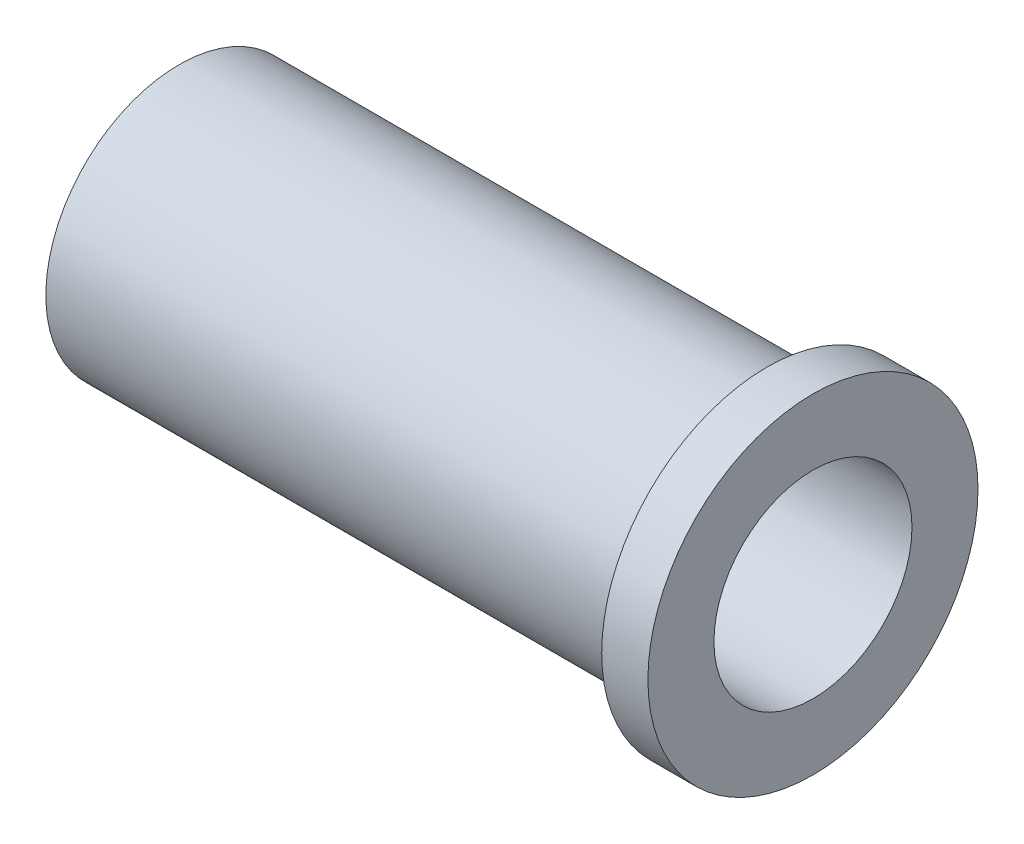
ISO-10303-21;
HEADER;
FILE_DESCRIPTION(('STEP AP214'),'2;1');
FILE_NAME('part.step','',(''),(''),'','','');
FILE_SCHEMA(('AUTOMOTIVE_DESIGN { 1 0 10303 214 1 1 1 1 }'));
ENDSEC;
DATA;
#1=APPLICATION_CONTEXT('core data for automotive mechanical design processes');
#2=APPLICATION_PROTOCOL_DEFINITION('international standard','automotive_design',2000,#1);
#3=PRODUCT_CONTEXT('',#1,'mechanical');
#4=PRODUCT('Part','Part','',(#3));
#5=PRODUCT_RELATED_PRODUCT_CATEGORY('part','',(#4));
#6=PRODUCT_DEFINITION_FORMATION('','',#4);
#7=PRODUCT_DEFINITION_CONTEXT('part definition',#1,'design');
#8=PRODUCT_DEFINITION('design','',#6,#7);
#9=PRODUCT_DEFINITION_SHAPE('','',#8);
#10=(LENGTH_UNIT() NAMED_UNIT(*) SI_UNIT(.MILLI.,.METRE.));
#11=(NAMED_UNIT(*) PLANE_ANGLE_UNIT() SI_UNIT($,.RADIAN.));
#12=(NAMED_UNIT(*) SI_UNIT($,.STERADIAN.) SOLID_ANGLE_UNIT());
#13=UNCERTAINTY_MEASURE_WITH_UNIT(LENGTH_MEASURE(1.E-05),#10,'distance_accuracy_value','');
#14=(GEOMETRIC_REPRESENTATION_CONTEXT(3) GLOBAL_UNCERTAINTY_ASSIGNED_CONTEXT((#13)) GLOBAL_UNIT_ASSIGNED_CONTEXT((#10,
#11,#12)) REPRESENTATION_CONTEXT('',''));
#15=CARTESIAN_POINT('',(0.,0.,0.));
#16=DIRECTION('',(0.,0.,1.));
#17=DIRECTION('',(1.,0.,0.));
#18=AXIS2_PLACEMENT_3D('',#15,#16,#17);
#19=CARTESIAN_POINT('',(48.,0.,0.));
#20=DIRECTION('',(-1.,0.,0.));
#21=DIRECTION('',(0.,0.,1.));
#22=AXIS2_PLACEMENT_3D('',#19,#20,#21);
#23=CYLINDRICAL_SURFACE('',#22,10.1);
#24=CARTESIAN_POINT('',(0.,0.,0.));
#25=DIRECTION('',(1.,0.,0.));
#26=DIRECTION('',(0.,0.,-1.));
#27=AXIS2_PLACEMENT_3D('',#24,#25,#26);
#28=CIRCLE('',#27,10.1);
#29=CARTESIAN_POINT('',(0.,0.,-10.1));
#30=VERTEX_POINT('',#29);
#31=EDGE_CURVE('E41',#30,#30,#28,.T.);
#32=ORIENTED_EDGE('',*,*,#31,.T.);
#33=EDGE_LOOP('',(#32));
#34=FACE_BOUND('',#33,.T.);
#35=CARTESIAN_POINT('',(44.5,0.,0.));
#36=DIRECTION('',(1.,0.,0.));
#37=DIRECTION('',(0.,0.,-1.));
#38=AXIS2_PLACEMENT_3D('',#35,#36,#37);
#39=CIRCLE('',#38,10.1);
#40=CARTESIAN_POINT('',(44.5,0.,-10.1));
#41=VERTEX_POINT('',#40);
#42=EDGE_CURVE('E10',#41,#41,#39,.T.);
#43=ORIENTED_EDGE('',*,*,#42,.F.);
#44=EDGE_LOOP('',(#43));
#45=FACE_BOUND('',#44,.T.);
#46=ADVANCED_FACE('F35',(#34,#45),#23,.T.);
#47=CARTESIAN_POINT('',(48.,0.,0.));
#48=DIRECTION('',(1.,0.,0.));
#49=DIRECTION('',(0.,0.,-1.));
#50=AXIS2_PLACEMENT_3D('',#47,#48,#49);
#51=PLANE('',#50);
#52=CARTESIAN_POINT('',(48.,0.,0.));
#53=DIRECTION('',(1.,0.,0.));
#54=DIRECTION('',(0.,0.,-1.));
#55=AXIS2_PLACEMENT_3D('',#52,#53,#54);
#56=CIRCLE('',#55,7.5);
#57=CARTESIAN_POINT('',(48.,0.,-7.5));
#58=VERTEX_POINT('',#57);
#59=EDGE_CURVE('E45',#58,#58,#56,.T.);
#60=ORIENTED_EDGE('',*,*,#59,.F.);
#61=EDGE_LOOP('',(#60));
#62=FACE_BOUND('',#61,.T.);
#63=CARTESIAN_POINT('',(48.,0.,0.));
#64=DIRECTION('',(1.,0.,0.));
#65=DIRECTION('',(0.,0.,-1.));
#66=AXIS2_PLACEMENT_3D('',#63,#64,#65);
#67=CIRCLE('',#66,12.5);
#68=CARTESIAN_POINT('',(48.,0.,-12.5));
#69=VERTEX_POINT('',#68);
#70=EDGE_CURVE('E55',#69,#69,#67,.T.);
#71=ORIENTED_EDGE('',*,*,#70,.T.);
#72=EDGE_LOOP('',(#71));
#73=FACE_BOUND('',#72,.T.);
#74=ADVANCED_FACE('F73',(#62,#73),#51,.T.);
#75=CARTESIAN_POINT('',(0.,0.,0.));
#76=DIRECTION('',(1.,0.,0.));
#77=DIRECTION('',(0.,0.,-1.));
#78=AXIS2_PLACEMENT_3D('',#75,#76,#77);
#79=PLANE('',#78);
#80=ORIENTED_EDGE('',*,*,#31,.F.);
#81=EDGE_LOOP('',(#80));
#82=FACE_BOUND('',#81,.T.);
#83=CARTESIAN_POINT('',(0.,0.,0.));
#84=DIRECTION('',(1.,0.,0.));
#85=DIRECTION('',(0.,0.,-1.));
#86=AXIS2_PLACEMENT_3D('',#83,#84,#85);
#87=CIRCLE('',#86,7.5);
#88=CARTESIAN_POINT('',(0.,0.,-7.5));
#89=VERTEX_POINT('',#88);
#90=EDGE_CURVE('E49',#89,#89,#87,.T.);
#91=ORIENTED_EDGE('',*,*,#90,.T.);
#92=EDGE_LOOP('',(#91));
#93=FACE_BOUND('',#92,.T.);
#94=ADVANCED_FACE('F77',(#82,#93),#79,.F.);
#95=CARTESIAN_POINT('',(48.,0.,0.));
#96=DIRECTION('',(-1.,0.,0.));
#97=DIRECTION('',(0.,0.,1.));
#98=AXIS2_PLACEMENT_3D('',#95,#96,#97);
#99=CYLINDRICAL_SURFACE('',#98,7.5);
#100=ORIENTED_EDGE('',*,*,#59,.T.);
#101=EDGE_LOOP('',(#100));
#102=FACE_BOUND('',#101,.T.);
#103=ORIENTED_EDGE('',*,*,#90,.F.);
#104=EDGE_LOOP('',(#103));
#105=FACE_BOUND('',#104,.T.);
#106=ADVANCED_FACE('F70',(#102,#105),#99,.F.);
#107=CARTESIAN_POINT('',(44.5,0.,0.));
#108=DIRECTION('',(1.,0.,0.));
#109=DIRECTION('',(0.,0.,-1.));
#110=AXIS2_PLACEMENT_3D('',#107,#108,#109);
#111=CYLINDRICAL_SURFACE('',#110,12.5);
#112=CARTESIAN_POINT('',(44.5,0.,0.));
#113=DIRECTION('',(1.,0.,0.));
#114=DIRECTION('',(0.,0.,-1.));
#115=AXIS2_PLACEMENT_3D('',#112,#113,#114);
#116=CIRCLE('',#115,12.5);
#117=CARTESIAN_POINT('',(44.5,0.,-12.5));
#118=VERTEX_POINT('',#117);
#119=EDGE_CURVE('E53',#118,#118,#116,.T.);
#120=ORIENTED_EDGE('',*,*,#119,.T.);
#121=EDGE_LOOP('',(#120));
#122=FACE_BOUND('',#121,.T.);
#123=ORIENTED_EDGE('',*,*,#70,.F.);
#124=EDGE_LOOP('',(#123));
#125=FACE_BOUND('',#124,.T.);
#126=ADVANCED_FACE('F61',(#122,#125),#111,.T.);
#127=CARTESIAN_POINT('',(44.5,0.,0.));
#128=DIRECTION('',(1.,0.,0.));
#129=DIRECTION('',(0.,0.,-1.));
#130=AXIS2_PLACEMENT_3D('',#127,#128,#129);
#131=PLANE('',#130);
#132=ORIENTED_EDGE('',*,*,#42,.T.);
#133=EDGE_LOOP('',(#132));
#134=FACE_BOUND('',#133,.T.);
#135=ORIENTED_EDGE('',*,*,#119,.F.);
#136=EDGE_LOOP('',(#135));
#137=FACE_BOUND('',#136,.T.);
#138=ADVANCED_FACE('F64',(#134,#137),#131,.F.);
#139=CLOSED_SHELL('',(#46,#74,#94,#106,#126,#138));
#140=MANIFOLD_SOLID_BREP('B2',#139);
#141=ADVANCED_BREP_SHAPE_REPRESENTATION('',(#18,#140),#14);
#142=SHAPE_DEFINITION_REPRESENTATION(#9,#141);
ENDSEC;
END-ISO-10303-21;
